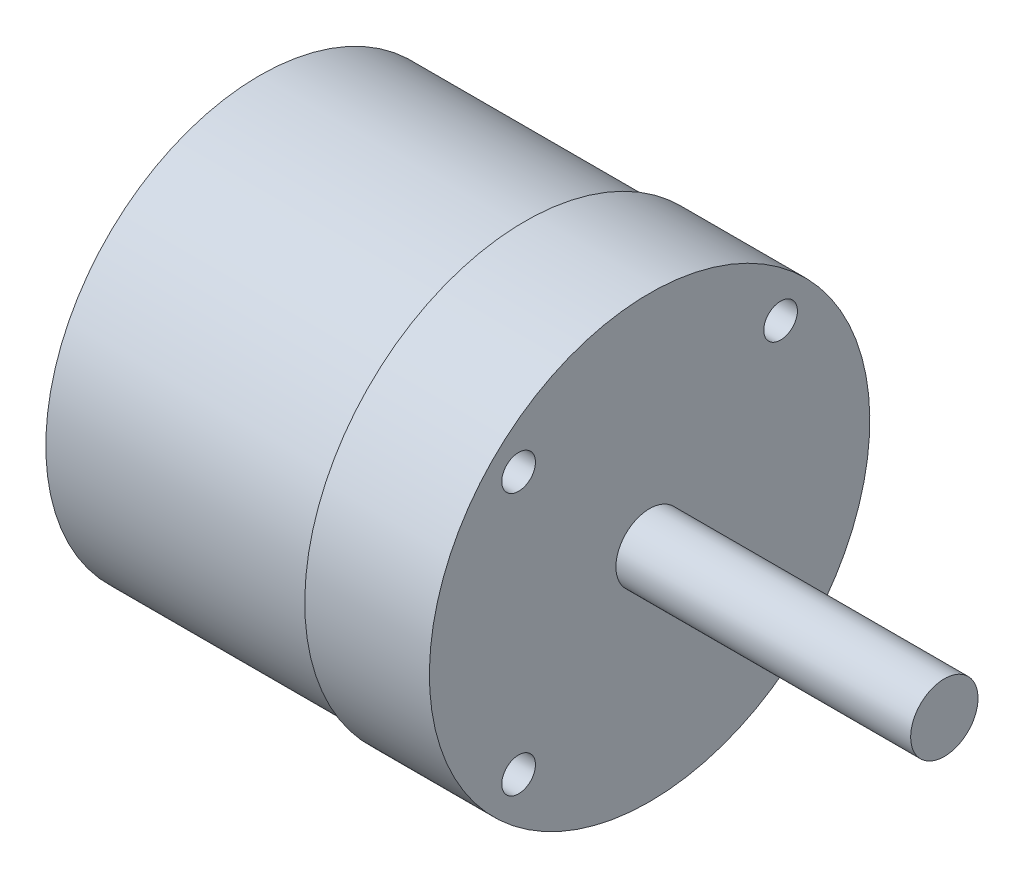
ISO-10303-21;
HEADER;
FILE_DESCRIPTION(('STEP AP214'),'2;1');
FILE_NAME('part.step','',(''),(''),'','','');
FILE_SCHEMA(('AUTOMOTIVE_DESIGN { 1 0 10303 214 1 1 1 1 }'));
ENDSEC;
DATA;
#1=APPLICATION_CONTEXT('core data for automotive mechanical design processes');
#2=APPLICATION_PROTOCOL_DEFINITION('international standard','automotive_design',2000,#1);
#3=PRODUCT_CONTEXT('',#1,'mechanical');
#4=PRODUCT('Part','Part','',(#3));
#5=PRODUCT_RELATED_PRODUCT_CATEGORY('part','',(#4));
#6=PRODUCT_DEFINITION_FORMATION('','',#4);
#7=PRODUCT_DEFINITION_CONTEXT('part definition',#1,'design');
#8=PRODUCT_DEFINITION('design','',#6,#7);
#9=PRODUCT_DEFINITION_SHAPE('','',#8);
#10=(LENGTH_UNIT() NAMED_UNIT(*) SI_UNIT(.MILLI.,.METRE.));
#11=(NAMED_UNIT(*) PLANE_ANGLE_UNIT() SI_UNIT($,.RADIAN.));
#12=(NAMED_UNIT(*) SI_UNIT($,.STERADIAN.) SOLID_ANGLE_UNIT());
#13=UNCERTAINTY_MEASURE_WITH_UNIT(LENGTH_MEASURE(1.E-05),#10,'distance_accuracy_value','');
#14=(GEOMETRIC_REPRESENTATION_CONTEXT(3) GLOBAL_UNCERTAINTY_ASSIGNED_CONTEXT((#13)) GLOBAL_UNIT_ASSIGNED_CONTEXT((#10,
#11,#12)) REPRESENTATION_CONTEXT('',''));
#15=CARTESIAN_POINT('',(0.,0.,0.));
#16=DIRECTION('',(0.,0.,1.));
#17=DIRECTION('',(1.,0.,0.));
#18=AXIS2_PLACEMENT_3D('',#15,#16,#17);
#19=CARTESIAN_POINT('',(0.,26.15,0.));
#20=DIRECTION('',(-1.,0.,0.));
#21=DIRECTION('',(0.,-1.,0.));
#22=AXIS2_PLACEMENT_3D('',#19,#20,#21);
#23=PLANE('',#22);
#24=CARTESIAN_POINT('',(0.,-15.556349186104,-15.5563491861041));
#25=DIRECTION('',(1.,0.,0.));
#26=DIRECTION('',(0.,1.,0.));
#27=AXIS2_PLACEMENT_3D('',#24,#25,#26);
#28=CIRCLE('',#27,2.00000000000001);
#29=CARTESIAN_POINT('',(0.,-13.556349186104,-15.5563491861041));
#30=VERTEX_POINT('',#29);
#31=EDGE_CURVE('E97',#30,#30,#28,.T.);
#32=ORIENTED_EDGE('',*,*,#31,.F.);
#33=EDGE_LOOP('',(#32));
#34=FACE_BOUND('',#33,.T.);
#35=CARTESIAN_POINT('',(0.,15.556349186104,-15.5563491861041));
#36=DIRECTION('',(1.,0.,0.));
#37=DIRECTION('',(0.,1.,0.));
#38=AXIS2_PLACEMENT_3D('',#35,#36,#37);
#39=CIRCLE('',#38,2.);
#40=CARTESIAN_POINT('',(0.,17.556349186104,-15.5563491861041));
#41=VERTEX_POINT('',#40);
#42=EDGE_CURVE('E111',#41,#41,#39,.T.);
#43=ORIENTED_EDGE('',*,*,#42,.F.);
#44=EDGE_LOOP('',(#43));
#45=FACE_BOUND('',#44,.T.);
#46=CARTESIAN_POINT('',(0.,15.556349186104,15.556349186104));
#47=DIRECTION('',(1.,0.,0.));
#48=DIRECTION('',(0.,1.,0.));
#49=AXIS2_PLACEMENT_3D('',#46,#47,#48);
#50=CIRCLE('',#49,2.);
#51=CARTESIAN_POINT('',(0.,17.556349186104,15.556349186104));
#52=VERTEX_POINT('',#51);
#53=EDGE_CURVE('E105',#52,#52,#50,.T.);
#54=ORIENTED_EDGE('',*,*,#53,.F.);
#55=EDGE_LOOP('',(#54));
#56=FACE_BOUND('',#55,.T.);
#57=CARTESIAN_POINT('',(0.,-15.556349186104,15.556349186104));
#58=DIRECTION('',(1.,0.,0.));
#59=DIRECTION('',(0.,1.,0.));
#60=AXIS2_PLACEMENT_3D('',#57,#58,#59);
#61=CIRCLE('',#60,2.);
#62=CARTESIAN_POINT('',(0.,-13.556349186104,15.556349186104));
#63=VERTEX_POINT('',#62);
#64=EDGE_CURVE('E104',#63,#63,#61,.T.);
#65=ORIENTED_EDGE('',*,*,#64,.F.);
#66=EDGE_LOOP('',(#65));
#67=FACE_BOUND('',#66,.T.);
#68=CARTESIAN_POINT('',(0.,0.,0.));
#69=DIRECTION('',(-1.,0.,0.));
#70=DIRECTION('',(0.,-1.,0.));
#71=AXIS2_PLACEMENT_3D('',#68,#69,#70);
#72=CIRCLE('',#71,26.15);
#73=CARTESIAN_POINT('',(0.,-26.1500000000001,0.));
#74=VERTEX_POINT('',#73);
#75=EDGE_CURVE('E151',#74,#74,#72,.T.);
#76=ORIENTED_EDGE('',*,*,#75,.F.);
#77=EDGE_LOOP('',(#76));
#78=FACE_BOUND('',#77,.T.);
#79=CARTESIAN_POINT('',(0.,0.,0.));
#80=DIRECTION('',(-1.,0.,0.));
#81=DIRECTION('',(0.,-1.,0.));
#82=AXIS2_PLACEMENT_3D('',#79,#80,#81);
#83=CIRCLE('',#82,4.00000000000003);
#84=CARTESIAN_POINT('',(0.,-4.00000000000006,0.));
#85=VERTEX_POINT('',#84);
#86=EDGE_CURVE('E122',#85,#85,#83,.T.);
#87=ORIENTED_EDGE('',*,*,#86,.T.);
#88=EDGE_LOOP('',(#87));
#89=FACE_BOUND('',#88,.T.);
#90=ADVANCED_FACE('F32',(#34,#45,#56,#67,#78,#89),#23,.F.);
#91=CARTESIAN_POINT('',(-163.925373134328,0.,0.));
#92=DIRECTION('',(-1.,0.,0.));
#93=DIRECTION('',(0.,-1.,0.));
#94=AXIS2_PLACEMENT_3D('',#91,#92,#93);
#95=CYLINDRICAL_SURFACE('',#94,26.15);
#96=CARTESIAN_POINT('',(-14.8,0.,0.));
#97=DIRECTION('',(-1.,0.,0.));
#98=DIRECTION('',(0.,-1.,0.));
#99=AXIS2_PLACEMENT_3D('',#96,#97,#98);
#100=CIRCLE('',#99,26.15);
#101=CARTESIAN_POINT('',(-14.8,-26.1500000000001,0.));
#102=VERTEX_POINT('',#101);
#103=EDGE_CURVE('E148',#102,#102,#100,.T.);
#104=ORIENTED_EDGE('',*,*,#103,.F.);
#105=EDGE_LOOP('',(#104));
#106=FACE_BOUND('',#105,.T.);
#107=ORIENTED_EDGE('',*,*,#75,.T.);
#108=EDGE_LOOP('',(#107));
#109=FACE_BOUND('',#108,.T.);
#110=ADVANCED_FACE('F222',(#106,#109),#95,.T.);
#111=CARTESIAN_POINT('',(-14.8,25.4,0.));
#112=DIRECTION('',(1.,0.,0.));
#113=DIRECTION('',(0.,1.,0.));
#114=AXIS2_PLACEMENT_3D('',#111,#112,#113);
#115=PLANE('',#114);
#116=CARTESIAN_POINT('',(-14.8,0.,0.));
#117=DIRECTION('',(-1.,0.,0.));
#118=DIRECTION('',(0.,-1.,0.));
#119=AXIS2_PLACEMENT_3D('',#116,#117,#118);
#120=CIRCLE('',#119,25.4);
#121=CARTESIAN_POINT('',(-14.8,-25.4000000000001,0.));
#122=VERTEX_POINT('',#121);
#123=EDGE_CURVE('E145',#122,#122,#120,.T.);
#124=ORIENTED_EDGE('',*,*,#123,.F.);
#125=EDGE_LOOP('',(#124));
#126=FACE_BOUND('',#125,.T.);
#127=ORIENTED_EDGE('',*,*,#103,.T.);
#128=EDGE_LOOP('',(#127));
#129=FACE_BOUND('',#128,.T.);
#130=ADVANCED_FACE('F227',(#126,#129),#115,.F.);
#131=CARTESIAN_POINT('',(-163.925373134328,0.,0.));
#132=DIRECTION('',(-1.,0.,0.));
#133=DIRECTION('',(0.,-1.,0.));
#134=AXIS2_PLACEMENT_3D('',#131,#132,#133);
#135=CYLINDRICAL_SURFACE('',#134,25.4);
#136=CARTESIAN_POINT('',(-46.3,0.,0.));
#137=DIRECTION('',(-1.,0.,0.));
#138=DIRECTION('',(0.,-1.,0.));
#139=AXIS2_PLACEMENT_3D('',#136,#137,#138);
#140=CIRCLE('',#139,25.4);
#141=CARTESIAN_POINT('',(-46.3,-25.4000000000001,0.));
#142=VERTEX_POINT('',#141);
#143=EDGE_CURVE('E142',#142,#142,#140,.T.);
#144=ORIENTED_EDGE('',*,*,#143,.F.);
#145=EDGE_LOOP('',(#144));
#146=FACE_BOUND('',#145,.T.);
#147=ORIENTED_EDGE('',*,*,#123,.T.);
#148=EDGE_LOOP('',(#147));
#149=FACE_BOUND('',#148,.T.);
#150=ADVANCED_FACE('F267',(#146,#149),#135,.T.);
#151=CARTESIAN_POINT('',(-46.3,7.5,0.));
#152=DIRECTION('',(1.,0.,0.));
#153=DIRECTION('',(0.,1.,0.));
#154=AXIS2_PLACEMENT_3D('',#151,#152,#153);
#155=PLANE('',#154);
#156=CARTESIAN_POINT('',(-46.3,0.,0.));
#157=DIRECTION('',(-1.,0.,0.));
#158=DIRECTION('',(0.,-1.,0.));
#159=AXIS2_PLACEMENT_3D('',#156,#157,#158);
#160=CIRCLE('',#159,7.50000000000004);
#161=CARTESIAN_POINT('',(-46.3,-7.50000000000008,0.));
#162=VERTEX_POINT('',#161);
#163=EDGE_CURVE('E139',#162,#162,#160,.T.);
#164=ORIENTED_EDGE('',*,*,#163,.F.);
#165=EDGE_LOOP('',(#164));
#166=FACE_BOUND('',#165,.T.);
#167=ORIENTED_EDGE('',*,*,#143,.T.);
#168=EDGE_LOOP('',(#167));
#169=FACE_BOUND('',#168,.T.);
#170=ADVANCED_FACE('F263',(#166,#169),#155,.F.);
#171=CARTESIAN_POINT('',(-163.925373134328,0.,0.));
#172=DIRECTION('',(-1.,0.,0.));
#173=DIRECTION('',(0.,-1.,0.));
#174=AXIS2_PLACEMENT_3D('',#171,#172,#173);
#175=CYLINDRICAL_SURFACE('',#174,7.50000000000004);
#176=CARTESIAN_POINT('',(-52.3,0.,0.));
#177=DIRECTION('',(-1.,0.,0.));
#178=DIRECTION('',(0.,-1.,0.));
#179=AXIS2_PLACEMENT_3D('',#176,#177,#178);
#180=CIRCLE('',#179,7.50000000000004);
#181=CARTESIAN_POINT('',(-52.3,-7.50000000000008,0.));
#182=VERTEX_POINT('',#181);
#183=EDGE_CURVE('E136',#182,#182,#180,.T.);
#184=ORIENTED_EDGE('',*,*,#183,.F.);
#185=EDGE_LOOP('',(#184));
#186=FACE_BOUND('',#185,.T.);
#187=ORIENTED_EDGE('',*,*,#163,.T.);
#188=EDGE_LOOP('',(#187));
#189=FACE_BOUND('',#188,.T.);
#190=ADVANCED_FACE('F259',(#186,#189),#175,.T.);
#191=CARTESIAN_POINT('',(-52.3,5.,0.));
#192=DIRECTION('',(1.,0.,0.));
#193=DIRECTION('',(0.,1.,0.));
#194=AXIS2_PLACEMENT_3D('',#191,#192,#193);
#195=PLANE('',#194);
#196=CARTESIAN_POINT('',(-52.3,0.,0.));
#197=DIRECTION('',(-1.,0.,0.));
#198=DIRECTION('',(0.,-1.,0.));
#199=AXIS2_PLACEMENT_3D('',#196,#197,#198);
#200=CIRCLE('',#199,5.00000000000004);
#201=CARTESIAN_POINT('',(-52.3,-5.00000000000008,0.));
#202=VERTEX_POINT('',#201);
#203=EDGE_CURVE('E133',#202,#202,#200,.T.);
#204=ORIENTED_EDGE('',*,*,#203,.F.);
#205=EDGE_LOOP('',(#204));
#206=FACE_BOUND('',#205,.T.);
#207=ORIENTED_EDGE('',*,*,#183,.T.);
#208=EDGE_LOOP('',(#207));
#209=FACE_BOUND('',#208,.T.);
#210=ADVANCED_FACE('F255',(#206,#209),#195,.F.);
#211=CARTESIAN_POINT('',(-163.925373134328,0.,0.));
#212=DIRECTION('',(-1.,0.,0.));
#213=DIRECTION('',(0.,-1.,0.));
#214=AXIS2_PLACEMENT_3D('',#211,#212,#213);
#215=CYLINDRICAL_SURFACE('',#214,5.00000000000004);
#216=CARTESIAN_POINT('',(-54.3,0.,0.));
#217=DIRECTION('',(-1.,0.,0.));
#218=DIRECTION('',(0.,-1.,0.));
#219=AXIS2_PLACEMENT_3D('',#216,#217,#218);
#220=CIRCLE('',#219,5.00000000000004);
#221=CARTESIAN_POINT('',(-54.3,-5.00000000000008,0.));
#222=VERTEX_POINT('',#221);
#223=EDGE_CURVE('E130',#222,#222,#220,.T.);
#224=ORIENTED_EDGE('',*,*,#223,.F.);
#225=EDGE_LOOP('',(#224));
#226=FACE_BOUND('',#225,.T.);
#227=ORIENTED_EDGE('',*,*,#203,.T.);
#228=EDGE_LOOP('',(#227));
#229=FACE_BOUND('',#228,.T.);
#230=ADVANCED_FACE('F249',(#226,#229),#215,.T.);
#231=CARTESIAN_POINT('',(-54.3,0.,0.));
#232=DIRECTION('',(1.,0.,0.));
#233=DIRECTION('',(0.,1.,0.));
#234=AXIS2_PLACEMENT_3D('',#231,#232,#233);
#235=PLANE('',#234);
#236=ORIENTED_EDGE('',*,*,#223,.T.);
#237=EDGE_LOOP('',(#236));
#238=FACE_BOUND('',#237,.T.);
#239=ADVANCED_FACE('F245',(#238),#235,.F.);
#240=CARTESIAN_POINT('',(35.,4.,0.));
#241=DIRECTION('',(-1.,0.,0.));
#242=DIRECTION('',(0.,-1.,0.));
#243=AXIS2_PLACEMENT_3D('',#240,#241,#242);
#244=PLANE('',#243);
#245=CARTESIAN_POINT('',(35.,0.,0.));
#246=DIRECTION('',(-1.,0.,0.));
#247=DIRECTION('',(0.,-1.,0.));
#248=AXIS2_PLACEMENT_3D('',#245,#246,#247);
#249=CIRCLE('',#248,4.00000000000003);
#250=CARTESIAN_POINT('',(35.,-4.00000000000005,0.));
#251=VERTEX_POINT('',#250);
#252=EDGE_CURVE('E127',#251,#251,#249,.T.);
#253=ORIENTED_EDGE('',*,*,#252,.F.);
#254=EDGE_LOOP('',(#253));
#255=FACE_BOUND('',#254,.T.);
#256=ADVANCED_FACE('F217',(#255),#244,.F.);
#257=CARTESIAN_POINT('',(-163.925373134328,0.,0.));
#258=DIRECTION('',(-1.,0.,0.));
#259=DIRECTION('',(0.,-1.,0.));
#260=AXIS2_PLACEMENT_3D('',#257,#258,#259);
#261=CYLINDRICAL_SURFACE('',#260,4.00000000000003);
#262=DIRECTION('',(-1.,0.,0.));
#263=VECTOR('',#262,1.);
#264=CARTESIAN_POINT('',(-163.925373134328,-3.70809924354792,1.49999999999999));
#265=LINE('',#264,#263);
#266=CARTESIAN_POINT('',(12.5,-3.70809924354789,1.5));
#267=VERTEX_POINT('',#266);
#268=CARTESIAN_POINT('',(17.5,-3.70809924354789,1.5));
#269=VERTEX_POINT('',#268);
#270=EDGE_CURVE('E11',#267,#269,#265,.F.);
#271=ORIENTED_EDGE('',*,*,#270,.T.);
#272=CARTESIAN_POINT('',(17.5,-3.70809924354789,1.5));
#273=CARTESIAN_POINT('',(17.5405925330296,-3.70809443619353,1.50000149729857));
#274=CARTESIAN_POINT('',(17.5811639292878,-3.70876663375757,1.49835118206537));
#275=CARTESIAN_POINT('',(17.6619845387273,-3.7114167321828,1.49177905295193));
#276=CARTESIAN_POINT('',(17.7022338554932,-3.71339419464466,1.48685833749724));
#277=CARTESIAN_POINT('',(17.8217672157252,-3.72118975606227,1.46729482367935));
#278=CARTESIAN_POINT('',(17.9001996602272,-3.72887188404215,1.44784998767984));
#279=CARTESIAN_POINT('',(18.0523675185151,-3.74825217997883,1.39690233043372));
#280=CARTESIAN_POINT('',(18.1261068290407,-3.75994696323816,1.36540966903062));
#281=CARTESIAN_POINT('',(18.2673335200613,-3.78602388200096,1.29134097725474));
#282=CARTESIAN_POINT('',(18.3348157220124,-3.8004082142657,1.24875587557703));
#283=CARTESIAN_POINT('',(18.4648919199407,-3.83103589828732,1.15146603872017));
#284=CARTESIAN_POINT('',(18.5271300143182,-3.84733374054258,1.09630269892844));
#285=CARTESIAN_POINT('',(18.6417235930174,-3.87949782068445,0.976394584974258));
#286=CARTESIAN_POINT('',(18.6940771643404,-3.89536397451685,0.911647960429702));
#287=CARTESIAN_POINT('',(18.7891402142536,-3.9255289389185,0.771693719740036));
#288=CARTESIAN_POINT('',(18.8314606006837,-3.93975598379759,0.696204968758629));
#289=CARTESIAN_POINT('',(18.9026519110829,-3.96438035322533,0.538553622304925));
#290=CARTESIAN_POINT('',(18.9315278494869,-3.97477910532581,0.456393528521807));
#291=CARTESIAN_POINT('',(18.9737577188216,-3.99018690464441,0.29149005067059));
#292=CARTESIAN_POINT('',(18.987727384304,-3.99540906103978,0.208924649211911));
#293=CARTESIAN_POINT('',(19.001721197932,-4.00064014015327,0.0424658385808897));
#294=CARTESIAN_POINT('',(19.0017496368019,-4.00065066686696,-0.0414271540462087));
#295=CARTESIAN_POINT('',(18.988218193771,-3.99559264174051,-0.203744100069406));
#296=CARTESIAN_POINT('',(18.9753305247926,-3.99077535168089,-0.282233282883082));
#297=CARTESIAN_POINT('',(18.9374637288878,-3.97693262269588,-0.435840275995114));
#298=CARTESIAN_POINT('',(18.9124839153537,-3.96790694481377,-0.510957894586928));
#299=CARTESIAN_POINT('',(18.8508296074042,-3.94637770601055,-0.656988917196575));
#300=CARTESIAN_POINT('',(18.8139901590766,-3.93382542785074,-0.727825198012177));
#301=CARTESIAN_POINT('',(18.7298079624269,-3.90651314175197,-0.862486444375063));
#302=CARTESIAN_POINT('',(18.6824617982127,-3.89175241632303,-0.926309119580086));
#303=CARTESIAN_POINT('',(18.5753768685089,-3.86052643048228,-1.04908600084313));
#304=CARTESIAN_POINT('',(18.515075615665,-3.84401196825713,-1.10753779261244));
#305=CARTESIAN_POINT('',(18.3854158656222,-3.81182684214324,-1.21369725159035));
#306=CARTESIAN_POINT('',(18.3160538253526,-3.79615651174153,-1.26140069584828));
#307=CARTESIAN_POINT('',(18.1682419715862,-3.76711867941036,-1.34567998313248));
#308=CARTESIAN_POINT('',(18.0896215943324,-3.75381153298459,-1.38197861969245));
#309=CARTESIAN_POINT('',(17.9267936781581,-3.7317144918135,-1.44059114536973));
#310=CARTESIAN_POINT('',(17.842595795067,-3.72291700934129,-1.46292853893353));
#311=CARTESIAN_POINT('',(17.7146189823522,-3.71406226852576,-1.48519272209728));
#312=CARTESIAN_POINT('',(17.6718976704794,-3.71183476402572,-1.49074028414002));
#313=CARTESIAN_POINT('',(17.5861259311283,-3.70885093143247,-1.49814308997677));
#314=CARTESIAN_POINT('',(17.5430758469706,-3.70809323601803,-1.50000176547338));
#315=CARTESIAN_POINT('',(17.5,-3.70809924354789,-1.5));
#316=B_SPLINE_CURVE_WITH_KNOTS('',3,(#272,#273,#274,#275,#276,#277,#278,#279,#280,#281,#282,
#283,#284,#285,#286,#287,#288,#289,#290,#291,#292,#293,#294,#295,#296,#297,#298,#299,#300,#301,
#302,#303,#304,#305,#306,#307,#308,#309,#310,#311,#312,#313,#314,#315),.UNSPECIFIED.,.F.,.F.,(4,
2,2,2,2,2,2,2,2,2,2,2,2,2,2,2,2,2,2,2,2,4),(0.,0.121697465666182,0.243354077586416,
0.485593064591345,0.727628221922012,0.96986193843128,1.22298027419407,1.47614754705134,
1.73793539440997,1.9996255232324,2.25002925199202,2.50035591335681,2.73829765644058,
2.97625291175452,3.21767225141682,3.45917019544674,3.71477993951631,3.97048993642583,
4.23200510445915,4.49307880432491,4.62233004062784,4.75146098044213),.UNSPECIFIED.);
#317=CARTESIAN_POINT('',(17.5,-3.70809924354787,-1.5));
#318=VERTEX_POINT('',#317);
#319=EDGE_CURVE('E154',#269,#318,#316,.T.);
#320=ORIENTED_EDGE('',*,*,#319,.T.);
#321=DIRECTION('',(-1.,0.,0.));
#322=VECTOR('',#321,1.);
#323=CARTESIAN_POINT('',(-163.925373134328,-3.70809924354791,-1.50000000000004));
#324=LINE('',#323,#322);
#325=CARTESIAN_POINT('',(12.5,-3.70809924354787,-1.50000000000004));
#326=VERTEX_POINT('',#325);
#327=EDGE_CURVE('E39',#318,#326,#324,.T.);
#328=ORIENTED_EDGE('',*,*,#327,.T.);
#329=CARTESIAN_POINT('',(12.5,-3.70809924354789,-1.5));
#330=CARTESIAN_POINT('',(12.4594074669704,-3.70809443619353,-1.50000149729856));
#331=CARTESIAN_POINT('',(12.4188360707122,-3.70876663375757,-1.49835118206537));
#332=CARTESIAN_POINT('',(12.3380154612727,-3.71141673218281,-1.49177905295192));
#333=CARTESIAN_POINT('',(12.2977661445068,-3.71339419464466,-1.48685833749724));
#334=CARTESIAN_POINT('',(12.1782327842748,-3.72118975606227,-1.46729482367934));
#335=CARTESIAN_POINT('',(12.0998003397728,-3.72887188404215,-1.44784998767984));
#336=CARTESIAN_POINT('',(11.9476324814849,-3.74825217997884,-1.39690233043372));
#337=CARTESIAN_POINT('',(11.8738931709593,-3.75994696323816,-1.36540966903062));
#338=CARTESIAN_POINT('',(11.7326664799387,-3.78602388200096,-1.29134097725473));
#339=CARTESIAN_POINT('',(11.6651842779876,-3.80040821426571,-1.24875587557702));
#340=CARTESIAN_POINT('',(11.5351080800593,-3.83103589828732,-1.15146603872016));
#341=CARTESIAN_POINT('',(11.4728699856818,-3.84733374054258,-1.09630269892843));
#342=CARTESIAN_POINT('',(11.3582764069826,-3.87949782068446,-0.976394584974254));
#343=CARTESIAN_POINT('',(11.3059228356596,-3.89536397451686,-0.911647960429699));
#344=CARTESIAN_POINT('',(11.2108597857464,-3.9255289389185,-0.771693719740033));
#345=CARTESIAN_POINT('',(11.1685393993163,-3.9397559837976,-0.696204968758626));
#346=CARTESIAN_POINT('',(11.0973480889171,-3.96438035322533,-0.538553622304922));
#347=CARTESIAN_POINT('',(11.0684721505131,-3.97477910532581,-0.456393528521804));
#348=CARTESIAN_POINT('',(11.0262422811784,-3.99018690464441,-0.291490050670586));
#349=CARTESIAN_POINT('',(11.012272615696,-3.99540906103978,-0.208924649211907));
#350=CARTESIAN_POINT('',(10.998278802068,-4.00064014015327,-0.0424658385808848));
#351=CARTESIAN_POINT('',(10.9982503631981,-4.00065066686697,0.0414271540462136));
#352=CARTESIAN_POINT('',(11.011781806229,-3.99559264174051,0.203744100069411));
#353=CARTESIAN_POINT('',(11.0246694752074,-3.99077535168089,0.282233282883086));
#354=CARTESIAN_POINT('',(11.0625362711122,-3.97693262269589,0.435840275995118));
#355=CARTESIAN_POINT('',(11.0875160846463,-3.96790694481378,0.510957894586932));
#356=CARTESIAN_POINT('',(11.1491703925958,-3.94637770601055,0.656988917196579));
#357=CARTESIAN_POINT('',(11.1860098409234,-3.93382542785074,0.727825198012182));
#358=CARTESIAN_POINT('',(11.2701920375731,-3.90651314175197,0.862486444375068));
#359=CARTESIAN_POINT('',(11.3175382017873,-3.89175241632303,0.926309119580091));
#360=CARTESIAN_POINT('',(11.4246231314911,-3.86052643048228,1.04908600084313));
#361=CARTESIAN_POINT('',(11.484924384335,-3.84401196825713,1.10753779261244));
#362=CARTESIAN_POINT('',(11.6145841343778,-3.81182684214324,1.21369725159035));
#363=CARTESIAN_POINT('',(11.6839461746474,-3.79615651174153,1.26140069584828));
#364=CARTESIAN_POINT('',(11.8317580284138,-3.76711867941036,1.34567998313248));
#365=CARTESIAN_POINT('',(11.9103784056676,-3.75381153298459,1.38197861969246));
#366=CARTESIAN_POINT('',(12.0732063218419,-3.7317144918135,1.44059114536973));
#367=CARTESIAN_POINT('',(12.157404204933,-3.72291700934129,1.46292853893353));
#368=CARTESIAN_POINT('',(12.2853810176478,-3.71406226852576,1.48519272209728));
#369=CARTESIAN_POINT('',(12.3281023295206,-3.71183476402572,1.49074028414002));
#370=CARTESIAN_POINT('',(12.4138740688717,-3.70885093143247,1.49814308997677));
#371=CARTESIAN_POINT('',(12.4569241530294,-3.70809323601803,1.50000176547338));
#372=CARTESIAN_POINT('',(12.5,-3.70809924354789,1.5));
#373=B_SPLINE_CURVE_WITH_KNOTS('',3,(#329,#330,#331,#332,#333,#334,#335,#336,#337,#338,#339,
#340,#341,#342,#343,#344,#345,#346,#347,#348,#349,#350,#351,#352,#353,#354,#355,#356,#357,#358,
#359,#360,#361,#362,#363,#364,#365,#366,#367,#368,#369,#370,#371,#372),.UNSPECIFIED.,.F.,.F.,(4,
2,2,2,2,2,2,2,2,2,2,2,2,2,2,2,2,2,2,2,2,4),(0.,0.121697465666185,0.243354077586418,
0.485593064591345,0.727628221922016,0.969861938431285,1.22298027419406,1.47614754705134,
1.73793539440997,1.9996255232324,2.25002925199203,2.50035591335681,2.73829765644058,
2.97625291175452,3.21767225141682,3.45917019544674,3.71477993951631,3.97048993642582,
4.23200510445915,4.49307880432491,4.62233004062784,4.75146098044213),.UNSPECIFIED.);
#374=EDGE_CURVE('E46',#326,#267,#373,.T.);
#375=ORIENTED_EDGE('',*,*,#374,.T.);
#376=EDGE_LOOP('',(#271,#320,#328,#375));
#377=FACE_BOUND('',#376,.T.);
#378=ORIENTED_EDGE('',*,*,#86,.F.);
#379=EDGE_LOOP('',(#378));
#380=FACE_BOUND('',#379,.T.);
#381=ORIENTED_EDGE('',*,*,#252,.T.);
#382=EDGE_LOOP('',(#381));
#383=FACE_BOUND('',#382,.T.);
#384=ADVANCED_FACE('F168',(#377,#380,#383),#261,.T.);
#385=CARTESIAN_POINT('',(-10.,-15.556349186104,15.556349186104));
#386=DIRECTION('',(1.,0.,0.));
#387=DIRECTION('',(0.,1.,0.));
#388=AXIS2_PLACEMENT_3D('',#385,#386,#387);
#389=CYLINDRICAL_SURFACE('',#388,2.);
#390=CARTESIAN_POINT('',(-10.,-15.556349186104,15.556349186104));
#391=DIRECTION('',(1.,0.,0.));
#392=DIRECTION('',(0.,1.,0.));
#393=AXIS2_PLACEMENT_3D('',#390,#391,#392);
#394=CIRCLE('',#393,2.);
#395=CARTESIAN_POINT('',(-10.,-13.556349186104,15.556349186104));
#396=VERTEX_POINT('',#395);
#397=EDGE_CURVE('E119',#396,#396,#394,.T.);
#398=ORIENTED_EDGE('',*,*,#397,.F.);
#399=EDGE_LOOP('',(#398));
#400=FACE_BOUND('',#399,.T.);
#401=ORIENTED_EDGE('',*,*,#64,.T.);
#402=EDGE_LOOP('',(#401));
#403=FACE_BOUND('',#402,.T.);
#404=ADVANCED_FACE('F210',(#400,#403),#389,.F.);
#405=CARTESIAN_POINT('',(-10.,-15.556349186104,15.556349186104));
#406=DIRECTION('',(1.,0.,0.));
#407=DIRECTION('',(0.,1.,0.));
#408=AXIS2_PLACEMENT_3D('',#405,#406,#407);
#409=PLANE('',#408);
#410=ORIENTED_EDGE('',*,*,#397,.T.);
#411=EDGE_LOOP('',(#410));
#412=FACE_BOUND('',#411,.T.);
#413=ADVANCED_FACE('F193',(#412),#409,.T.);
#414=CARTESIAN_POINT('',(-10.,15.556349186104,15.556349186104));
#415=DIRECTION('',(1.,0.,0.));
#416=DIRECTION('',(0.,1.,0.));
#417=AXIS2_PLACEMENT_3D('',#414,#415,#416);
#418=CYLINDRICAL_SURFACE('',#417,2.);
#419=CARTESIAN_POINT('',(-10.,15.556349186104,15.556349186104));
#420=DIRECTION('',(1.,0.,0.));
#421=DIRECTION('',(0.,1.,0.));
#422=AXIS2_PLACEMENT_3D('',#419,#420,#421);
#423=CIRCLE('',#422,2.);
#424=CARTESIAN_POINT('',(-10.,17.556349186104,15.556349186104));
#425=VERTEX_POINT('',#424);
#426=EDGE_CURVE('E101',#425,#425,#423,.T.);
#427=ORIENTED_EDGE('',*,*,#426,.F.);
#428=EDGE_LOOP('',(#427));
#429=FACE_BOUND('',#428,.T.);
#430=ORIENTED_EDGE('',*,*,#53,.T.);
#431=EDGE_LOOP('',(#430));
#432=FACE_BOUND('',#431,.T.);
#433=ADVANCED_FACE('F189',(#429,#432),#418,.F.);
#434=CARTESIAN_POINT('',(-10.,15.556349186104,15.556349186104));
#435=DIRECTION('',(1.,0.,0.));
#436=DIRECTION('',(0.,1.,0.));
#437=AXIS2_PLACEMENT_3D('',#434,#435,#436);
#438=PLANE('',#437);
#439=ORIENTED_EDGE('',*,*,#426,.T.);
#440=EDGE_LOOP('',(#439));
#441=FACE_BOUND('',#440,.T.);
#442=ADVANCED_FACE('F185',(#441),#438,.T.);
#443=CARTESIAN_POINT('',(-10.,15.556349186104,-15.5563491861041));
#444=DIRECTION('',(1.,0.,0.));
#445=DIRECTION('',(0.,1.,0.));
#446=AXIS2_PLACEMENT_3D('',#443,#444,#445);
#447=CYLINDRICAL_SURFACE('',#446,2.);
#448=CARTESIAN_POINT('',(-10.,15.556349186104,-15.5563491861041));
#449=DIRECTION('',(1.,0.,0.));
#450=DIRECTION('',(0.,1.,0.));
#451=AXIS2_PLACEMENT_3D('',#448,#449,#450);
#452=CIRCLE('',#451,2.);
#453=CARTESIAN_POINT('',(-10.,17.556349186104,-15.5563491861041));
#454=VERTEX_POINT('',#453);
#455=EDGE_CURVE('E108',#454,#454,#452,.T.);
#456=ORIENTED_EDGE('',*,*,#455,.F.);
#457=EDGE_LOOP('',(#456));
#458=FACE_BOUND('',#457,.T.);
#459=ORIENTED_EDGE('',*,*,#42,.T.);
#460=EDGE_LOOP('',(#459));
#461=FACE_BOUND('',#460,.T.);
#462=ADVANCED_FACE('F188',(#458,#461),#447,.F.);
#463=CARTESIAN_POINT('',(-10.,15.556349186104,-15.5563491861041));
#464=DIRECTION('',(1.,0.,0.));
#465=DIRECTION('',(0.,1.,0.));
#466=AXIS2_PLACEMENT_3D('',#463,#464,#465);
#467=PLANE('',#466);
#468=ORIENTED_EDGE('',*,*,#455,.T.);
#469=EDGE_LOOP('',(#468));
#470=FACE_BOUND('',#469,.T.);
#471=ADVANCED_FACE('F195',(#470),#467,.T.);
#472=CARTESIAN_POINT('',(-10.,-15.556349186104,-15.5563491861041));
#473=DIRECTION('',(1.,0.,0.));
#474=DIRECTION('',(0.,1.,0.));
#475=AXIS2_PLACEMENT_3D('',#472,#473,#474);
#476=CYLINDRICAL_SURFACE('',#475,2.00000000000001);
#477=CARTESIAN_POINT('',(-10.,-15.556349186104,-15.5563491861041));
#478=DIRECTION('',(1.,0.,0.));
#479=DIRECTION('',(0.,1.,0.));
#480=AXIS2_PLACEMENT_3D('',#477,#478,#479);
#481=CIRCLE('',#480,2.00000000000001);
#482=CARTESIAN_POINT('',(-10.,-13.556349186104,-15.5563491861041));
#483=VERTEX_POINT('',#482);
#484=EDGE_CURVE('E114',#483,#483,#481,.T.);
#485=ORIENTED_EDGE('',*,*,#484,.F.);
#486=EDGE_LOOP('',(#485));
#487=FACE_BOUND('',#486,.T.);
#488=ORIENTED_EDGE('',*,*,#31,.T.);
#489=EDGE_LOOP('',(#488));
#490=FACE_BOUND('',#489,.T.);
#491=ADVANCED_FACE('F198',(#487,#490),#476,.F.);
#492=CARTESIAN_POINT('',(-10.,-15.556349186104,-15.5563491861041));
#493=DIRECTION('',(1.,0.,0.));
#494=DIRECTION('',(0.,1.,0.));
#495=AXIS2_PLACEMENT_3D('',#492,#493,#494);
#496=PLANE('',#495);
#497=ORIENTED_EDGE('',*,*,#484,.T.);
#498=EDGE_LOOP('',(#497));
#499=FACE_BOUND('',#498,.T.);
#500=ADVANCED_FACE('F184',(#499),#496,.T.);
#501=CARTESIAN_POINT('',(12.5,-2.00000000000006,0.));
#502=DIRECTION('',(0.,-1.,0.));
#503=DIRECTION('',(1.,0.,0.));
#504=AXIS2_PLACEMENT_3D('',#501,#502,#503);
#505=CYLINDRICAL_SURFACE('',#504,1.5);
#506=DIRECTION('',(0.,-1.,0.));
#507=VECTOR('',#506,1.);
#508=CARTESIAN_POINT('',(12.5,-2.00000000000006,-1.5));
#509=LINE('',#508,#507);
#510=CARTESIAN_POINT('',(12.5,-2.00000000000006,-1.5));
#511=VERTEX_POINT('',#510);
#512=EDGE_CURVE('E69',#511,#326,#509,.T.);
#513=ORIENTED_EDGE('',*,*,#512,.F.);
#514=CARTESIAN_POINT('',(12.5,-2.00000000000006,0.));
#515=DIRECTION('',(0.,-1.,0.));
#516=DIRECTION('',(1.,0.,0.));
#517=AXIS2_PLACEMENT_3D('',#514,#515,#516);
#518=CIRCLE('',#517,1.5);
#519=CARTESIAN_POINT('',(12.5,-2.00000000000006,1.5));
#520=VERTEX_POINT('',#519);
#521=EDGE_CURVE('E73',#520,#511,#518,.T.);
#522=ORIENTED_EDGE('',*,*,#521,.F.);
#523=DIRECTION('',(0.,-1.,0.));
#524=VECTOR('',#523,1.);
#525=CARTESIAN_POINT('',(12.5,-2.00000000000006,1.5));
#526=LINE('',#525,#524);
#527=EDGE_CURVE('E95',#520,#267,#526,.T.);
#528=ORIENTED_EDGE('',*,*,#527,.T.);
#529=ORIENTED_EDGE('',*,*,#374,.F.);
#530=EDGE_LOOP('',(#513,#522,#528,#529));
#531=FACE_BOUND('',#530,.T.);
#532=ADVANCED_FACE('F71',(#531),#505,.F.);
#533=CARTESIAN_POINT('',(12.5,-2.00000000000006,1.5));
#534=DIRECTION('',(0.,0.,1.));
#535=DIRECTION('',(1.,0.,0.));
#536=AXIS2_PLACEMENT_3D('',#533,#534,#535);
#537=PLANE('',#536);
#538=ORIENTED_EDGE('',*,*,#527,.F.);
#539=DIRECTION('',(-1.,0.,0.));
#540=VECTOR('',#539,1.);
#541=CARTESIAN_POINT('',(12.5,-2.00000000000006,1.5));
#542=LINE('',#541,#540);
#543=CARTESIAN_POINT('',(17.5,-2.00000000000005,1.5));
#544=VERTEX_POINT('',#543);
#545=EDGE_CURVE('E78',#544,#520,#542,.T.);
#546=ORIENTED_EDGE('',*,*,#545,.F.);
#547=DIRECTION('',(0.,-1.,0.));
#548=VECTOR('',#547,1.);
#549=CARTESIAN_POINT('',(17.5,-2.00000000000005,1.5));
#550=LINE('',#549,#548);
#551=EDGE_CURVE('E98',#544,#269,#550,.T.);
#552=ORIENTED_EDGE('',*,*,#551,.T.);
#553=ORIENTED_EDGE('',*,*,#270,.F.);
#554=EDGE_LOOP('',(#538,#546,#552,#553));
#555=FACE_BOUND('',#554,.T.);
#556=ADVANCED_FACE('F177',(#555),#537,.F.);
#557=CARTESIAN_POINT('',(17.5,-2.00000000000005,0.));
#558=DIRECTION('',(0.,-1.,0.));
#559=DIRECTION('',(1.,0.,0.));
#560=AXIS2_PLACEMENT_3D('',#557,#558,#559);
#561=CYLINDRICAL_SURFACE('',#560,1.5);
#562=ORIENTED_EDGE('',*,*,#551,.F.);
#563=CARTESIAN_POINT('',(17.5,-2.00000000000005,0.));
#564=DIRECTION('',(0.,-1.,0.));
#565=DIRECTION('',(1.,0.,0.));
#566=AXIS2_PLACEMENT_3D('',#563,#564,#565);
#567=CIRCLE('',#566,1.5);
#568=CARTESIAN_POINT('',(17.5,-2.00000000000005,-1.5));
#569=VERTEX_POINT('',#568);
#570=EDGE_CURVE('E87',#569,#544,#567,.T.);
#571=ORIENTED_EDGE('',*,*,#570,.F.);
#572=DIRECTION('',(0.,-1.,0.));
#573=VECTOR('',#572,1.);
#574=CARTESIAN_POINT('',(17.5,-2.00000000000005,-1.5));
#575=LINE('',#574,#573);
#576=EDGE_CURVE('E77',#569,#318,#575,.T.);
#577=ORIENTED_EDGE('',*,*,#576,.T.);
#578=ORIENTED_EDGE('',*,*,#319,.F.);
#579=EDGE_LOOP('',(#562,#571,#577,#578));
#580=FACE_BOUND('',#579,.T.);
#581=ADVANCED_FACE('F172',(#580),#561,.F.);
#582=CARTESIAN_POINT('',(12.5,-2.00000000000006,-1.5));
#583=DIRECTION('',(0.,0.,-1.));
#584=DIRECTION('',(-1.,0.,0.));
#585=AXIS2_PLACEMENT_3D('',#582,#583,#584);
#586=PLANE('',#585);
#587=ORIENTED_EDGE('',*,*,#576,.F.);
#588=DIRECTION('',(1.,0.,0.));
#589=VECTOR('',#588,1.);
#590=CARTESIAN_POINT('',(12.5,-2.00000000000006,-1.5));
#591=LINE('',#590,#589);
#592=EDGE_CURVE('E81',#511,#569,#591,.T.);
#593=ORIENTED_EDGE('',*,*,#592,.F.);
#594=ORIENTED_EDGE('',*,*,#512,.T.);
#595=ORIENTED_EDGE('',*,*,#327,.F.);
#596=EDGE_LOOP('',(#587,#593,#594,#595));
#597=FACE_BOUND('',#596,.T.);
#598=ADVANCED_FACE('F82',(#597),#586,.F.);
#599=CARTESIAN_POINT('',(12.5,-2.00000000000006,0.));
#600=DIRECTION('',(0.,-1.,0.));
#601=DIRECTION('',(1.,0.,0.));
#602=AXIS2_PLACEMENT_3D('',#599,#600,#601);
#603=PLANE('',#602);
#604=ORIENTED_EDGE('',*,*,#521,.T.);
#605=ORIENTED_EDGE('',*,*,#592,.T.);
#606=ORIENTED_EDGE('',*,*,#570,.T.);
#607=ORIENTED_EDGE('',*,*,#545,.T.);
#608=EDGE_LOOP('',(#604,#605,#606,#607));
#609=FACE_BOUND('',#608,.T.);
#610=ADVANCED_FACE('F89',(#609),#603,.T.);
#611=CLOSED_SHELL('',(#90,#110,#130,#150,#170,#190,#210,#230,#239,#256,#384,#404,#413,#433,#442,
#462,#471,#491,#500,#532,#556,#581,#598,#610));
#612=MANIFOLD_SOLID_BREP('B2',#611);
#613=ADVANCED_BREP_SHAPE_REPRESENTATION('',(#18,#612),#14);
#614=SHAPE_DEFINITION_REPRESENTATION(#9,#613);
ENDSEC;
END-ISO-10303-21;
